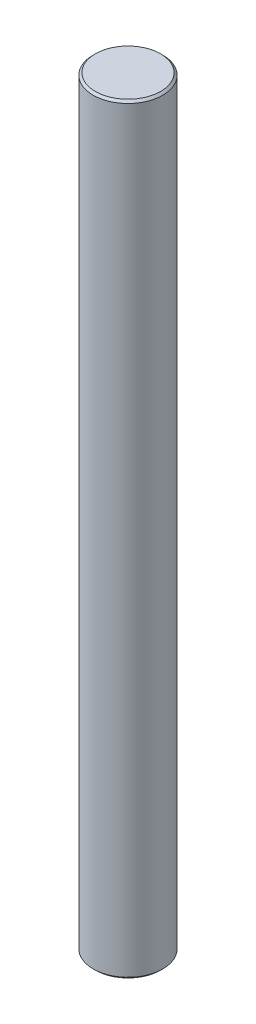
ISO-10303-21;
HEADER;
FILE_DESCRIPTION(('STEP AP214'),'2;1');
FILE_NAME('part.step','',(''),(''),'','','');
FILE_SCHEMA(('AUTOMOTIVE_DESIGN { 1 0 10303 214 1 1 1 1 }'));
ENDSEC;
DATA;
#1=APPLICATION_CONTEXT('core data for automotive mechanical design processes');
#2=APPLICATION_PROTOCOL_DEFINITION('international standard','automotive_design',2000,#1);
#3=PRODUCT_CONTEXT('',#1,'mechanical');
#4=PRODUCT('Part','Part','',(#3));
#5=PRODUCT_RELATED_PRODUCT_CATEGORY('part','',(#4));
#6=PRODUCT_DEFINITION_FORMATION('','',#4);
#7=PRODUCT_DEFINITION_CONTEXT('part definition',#1,'design');
#8=PRODUCT_DEFINITION('design','',#6,#7);
#9=PRODUCT_DEFINITION_SHAPE('','',#8);
#10=(LENGTH_UNIT() NAMED_UNIT(*) SI_UNIT(.MILLI.,.METRE.));
#11=(NAMED_UNIT(*) PLANE_ANGLE_UNIT() SI_UNIT($,.RADIAN.));
#12=(NAMED_UNIT(*) SI_UNIT($,.STERADIAN.) SOLID_ANGLE_UNIT());
#13=UNCERTAINTY_MEASURE_WITH_UNIT(LENGTH_MEASURE(1.E-05),#10,'distance_accuracy_value','');
#14=(GEOMETRIC_REPRESENTATION_CONTEXT(3) GLOBAL_UNCERTAINTY_ASSIGNED_CONTEXT((#13)) GLOBAL_UNIT_ASSIGNED_CONTEXT((#10,
#11,#12)) REPRESENTATION_CONTEXT('',''));
#15=CARTESIAN_POINT('',(0.,0.,0.));
#16=DIRECTION('',(0.,0.,1.));
#17=DIRECTION('',(1.,0.,0.));
#18=AXIS2_PLACEMENT_3D('',#15,#16,#17);
#19=CARTESIAN_POINT('',(0.,350.,0.));
#20=DIRECTION('',(0.,-1.,0.));
#21=DIRECTION('',(0.,0.,-1.));
#22=AXIS2_PLACEMENT_3D('',#19,#20,#21);
#23=CYLINDRICAL_SURFACE('',#22,16.);
#24=CARTESIAN_POINT('',(0.,1.00000000000006,0.));
#25=DIRECTION('',(0.,1.,0.));
#26=DIRECTION('',(0.,0.,1.));
#27=AXIS2_PLACEMENT_3D('',#24,#25,#26);
#28=CIRCLE('',#27,16.);
#29=CARTESIAN_POINT('',(0.,1.00000000000006,16.));
#30=VERTEX_POINT('',#29);
#31=EDGE_CURVE('E52',#30,#30,#28,.T.);
#32=ORIENTED_EDGE('',*,*,#31,.T.);
#33=EDGE_LOOP('',(#32));
#34=FACE_BOUND('',#33,.T.);
#35=CARTESIAN_POINT('',(0.,349.,0.));
#36=DIRECTION('',(0.,1.,0.));
#37=DIRECTION('',(0.,0.,1.));
#38=AXIS2_PLACEMENT_3D('',#35,#36,#37);
#39=CIRCLE('',#38,16.);
#40=CARTESIAN_POINT('',(0.,349.,16.));
#41=VERTEX_POINT('',#40);
#42=EDGE_CURVE('E57',#41,#41,#39,.F.);
#43=ORIENTED_EDGE('',*,*,#42,.T.);
#44=EDGE_LOOP('',(#43));
#45=FACE_BOUND('',#44,.T.);
#46=ADVANCED_FACE('F38',(#34,#45),#23,.T.);
#47=CARTESIAN_POINT('',(0.,350.,0.));
#48=DIRECTION('',(0.,1.,0.));
#49=DIRECTION('',(0.,0.,1.));
#50=AXIS2_PLACEMENT_3D('',#47,#48,#49);
#51=PLANE('',#50);
#52=CARTESIAN_POINT('',(0.,350.,0.));
#53=DIRECTION('',(0.,1.,0.));
#54=DIRECTION('',(0.,0.,1.));
#55=AXIS2_PLACEMENT_3D('',#52,#53,#54);
#56=CIRCLE('',#55,15.);
#57=CARTESIAN_POINT('',(0.,350.,15.));
#58=VERTEX_POINT('',#57);
#59=EDGE_CURVE('E10',#58,#58,#56,.T.);
#60=ORIENTED_EDGE('',*,*,#59,.T.);
#61=EDGE_LOOP('',(#60));
#62=FACE_BOUND('',#61,.T.);
#63=ADVANCED_FACE('F74',(#62),#51,.T.);
#64=CARTESIAN_POINT('',(0.,0.,0.));
#65=DIRECTION('',(0.,1.,0.));
#66=DIRECTION('',(0.,0.,1.));
#67=AXIS2_PLACEMENT_3D('',#64,#65,#66);
#68=PLANE('',#67);
#69=CARTESIAN_POINT('',(0.,0.,0.));
#70=DIRECTION('',(0.,1.,0.));
#71=DIRECTION('',(0.,0.,1.));
#72=AXIS2_PLACEMENT_3D('',#69,#70,#71);
#73=CIRCLE('',#72,15.);
#74=CARTESIAN_POINT('',(0.,0.,15.));
#75=VERTEX_POINT('',#74);
#76=EDGE_CURVE('E47',#75,#75,#73,.F.);
#77=ORIENTED_EDGE('',*,*,#76,.T.);
#78=EDGE_LOOP('',(#77));
#79=FACE_BOUND('',#78,.T.);
#80=ADVANCED_FACE('F71',(#79),#68,.F.);
#81=CARTESIAN_POINT('',(0.,1.00000000000006,0.));
#82=DIRECTION('',(0.,1.,0.));
#83=DIRECTION('',(0.,0.,1.));
#84=AXIS2_PLACEMENT_3D('',#81,#82,#83);
#85=CONICAL_SURFACE('',#84,16.,0.785398163397441);
#86=ORIENTED_EDGE('',*,*,#76,.F.);
#87=EDGE_LOOP('',(#86));
#88=FACE_BOUND('',#87,.T.);
#89=ORIENTED_EDGE('',*,*,#31,.F.);
#90=EDGE_LOOP('',(#89));
#91=FACE_BOUND('',#90,.T.);
#92=ADVANCED_FACE('F67',(#88,#91),#85,.T.);
#93=CARTESIAN_POINT('',(0.,350.,0.));
#94=DIRECTION('',(0.,-1.,0.));
#95=DIRECTION('',(0.,0.,-1.));
#96=AXIS2_PLACEMENT_3D('',#93,#94,#95);
#97=CONICAL_SURFACE('',#96,15.,0.785398163397469);
#98=ORIENTED_EDGE('',*,*,#42,.F.);
#99=EDGE_LOOP('',(#98));
#100=FACE_BOUND('',#99,.T.);
#101=ORIENTED_EDGE('',*,*,#59,.F.);
#102=EDGE_LOOP('',(#101));
#103=FACE_BOUND('',#102,.T.);
#104=ADVANCED_FACE('F41',(#100,#103),#97,.T.);
#105=CLOSED_SHELL('',(#46,#63,#80,#92,#104));
#106=MANIFOLD_SOLID_BREP('B2',#105);
#107=ADVANCED_BREP_SHAPE_REPRESENTATION('',(#18,#106),#14);
#108=SHAPE_DEFINITION_REPRESENTATION(#9,#107);
ENDSEC;
END-ISO-10303-21;
